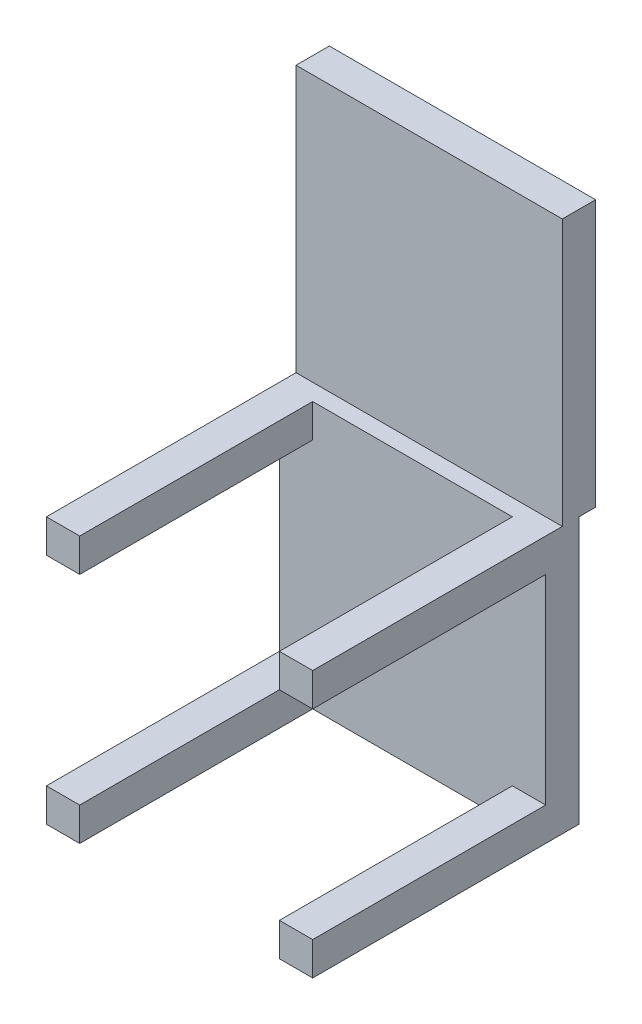
ISO-10303-21;
HEADER;
FILE_DESCRIPTION(('STEP AP214'),'2;1');
FILE_NAME('part.step','',(''),(''),'','','');
FILE_SCHEMA(('AUTOMOTIVE_DESIGN { 1 0 10303 214 1 1 1 1 }'));
ENDSEC;
DATA;
#1=APPLICATION_CONTEXT('core data for automotive mechanical design processes');
#2=APPLICATION_PROTOCOL_DEFINITION('international standard','automotive_design',2000,#1);
#3=PRODUCT_CONTEXT('',#1,'mechanical');
#4=PRODUCT('Part','Part','',(#3));
#5=PRODUCT_RELATED_PRODUCT_CATEGORY('part','',(#4));
#6=PRODUCT_DEFINITION_FORMATION('','',#4);
#7=PRODUCT_DEFINITION_CONTEXT('part definition',#1,'design');
#8=PRODUCT_DEFINITION('design','',#6,#7);
#9=PRODUCT_DEFINITION_SHAPE('','',#8);
#10=(LENGTH_UNIT() NAMED_UNIT(*) SI_UNIT(.MILLI.,.METRE.));
#11=(NAMED_UNIT(*) PLANE_ANGLE_UNIT() SI_UNIT($,.RADIAN.));
#12=(NAMED_UNIT(*) SI_UNIT($,.STERADIAN.) SOLID_ANGLE_UNIT());
#13=UNCERTAINTY_MEASURE_WITH_UNIT(LENGTH_MEASURE(1.E-05),#10,'distance_accuracy_value','');
#14=(GEOMETRIC_REPRESENTATION_CONTEXT(3) GLOBAL_UNCERTAINTY_ASSIGNED_CONTEXT((#13)) GLOBAL_UNIT_ASSIGNED_CONTEXT((#10,
#11,#12)) REPRESENTATION_CONTEXT('',''));
#15=CARTESIAN_POINT('',(0.,0.,0.));
#16=DIRECTION('',(0.,0.,1.));
#17=DIRECTION('',(1.,0.,0.));
#18=AXIS2_PLACEMENT_3D('',#15,#16,#17);
#19=CARTESIAN_POINT('',(-200.,200.,50.));
#20=DIRECTION('',(0.,-1.,0.));
#21=DIRECTION('',(0.,0.,-1.));
#22=AXIS2_PLACEMENT_3D('',#19,#20,#21);
#23=PLANE('',#22);
#24=DIRECTION('',(1.,0.,0.));
#25=VECTOR('',#24,1.);
#26=CARTESIAN_POINT('',(-200.,200.,25.));
#27=LINE('',#26,#25);
#28=CARTESIAN_POINT('',(-200.,200.,25.));
#29=VERTEX_POINT('',#28);
#30=CARTESIAN_POINT('',(200.,200.,25.));
#31=VERTEX_POINT('',#30);
#32=EDGE_CURVE('E55',#29,#31,#27,.T.);
#33=ORIENTED_EDGE('',*,*,#32,.F.);
#34=DIRECTION('',(0.,0.,-1.));
#35=VECTOR('',#34,1.);
#36=CARTESIAN_POINT('',(-200.,200.,50.));
#37=LINE('',#36,#35);
#38=CARTESIAN_POINT('',(-200.,200.,400.));
#39=VERTEX_POINT('',#38);
#40=EDGE_CURVE('E49',#39,#29,#37,.T.);
#41=ORIENTED_EDGE('',*,*,#40,.F.);
#42=DIRECTION('',(-1.,0.,0.));
#43=VECTOR('',#42,1.);
#44=CARTESIAN_POINT('',(-200.,200.,400.));
#45=LINE('',#44,#43);
#46=CARTESIAN_POINT('',(-150.,200.,400.));
#47=VERTEX_POINT('',#46);
#48=EDGE_CURVE('E256',#47,#39,#45,.T.);
#49=ORIENTED_EDGE('',*,*,#48,.F.);
#50=DIRECTION('',(0.,0.,-1.));
#51=VECTOR('',#50,1.);
#52=CARTESIAN_POINT('',(-150.,200.,400.));
#53=LINE('',#52,#51);
#54=CARTESIAN_POINT('',(-150.,200.,50.));
#55=VERTEX_POINT('',#54);
#56=EDGE_CURVE('E269',#47,#55,#53,.T.);
#57=ORIENTED_EDGE('',*,*,#56,.T.);
#58=DIRECTION('',(-1.,0.,0.));
#59=VECTOR('',#58,1.);
#60=CARTESIAN_POINT('',(-200.,200.,50.));
#61=LINE('',#60,#59);
#62=CARTESIAN_POINT('',(150.,200.,50.));
#63=VERTEX_POINT('',#62);
#64=EDGE_CURVE('E305',#63,#55,#61,.T.);
#65=ORIENTED_EDGE('',*,*,#64,.F.);
#66=DIRECTION('',(0.,0.,-1.));
#67=VECTOR('',#66,1.);
#68=CARTESIAN_POINT('',(150.,200.,400.));
#69=LINE('',#68,#67);
#70=CARTESIAN_POINT('',(150.,200.,400.));
#71=VERTEX_POINT('',#70);
#72=EDGE_CURVE('E293',#71,#63,#69,.T.);
#73=ORIENTED_EDGE('',*,*,#72,.F.);
#74=DIRECTION('',(-1.,0.,0.));
#75=VECTOR('',#74,1.);
#76=CARTESIAN_POINT('',(150.,200.,400.));
#77=LINE('',#76,#75);
#78=CARTESIAN_POINT('',(200.,200.,400.));
#79=VERTEX_POINT('',#78);
#80=EDGE_CURVE('E281',#79,#71,#77,.T.);
#81=ORIENTED_EDGE('',*,*,#80,.F.);
#82=DIRECTION('',(0.,0.,-1.));
#83=VECTOR('',#82,1.);
#84=CARTESIAN_POINT('',(200.,200.,50.));
#85=LINE('',#84,#83);
#86=EDGE_CURVE('E11',#79,#31,#85,.T.);
#87=ORIENTED_EDGE('',*,*,#86,.T.);
#88=EDGE_LOOP('',(#33,#41,#49,#57,#65,#73,#81,#87));
#89=FACE_BOUND('',#88,.T.);
#90=ADVANCED_FACE('F41',(#89),#23,.F.);
#91=CARTESIAN_POINT('',(0.,0.,50.));
#92=DIRECTION('',(0.,0.,-1.));
#93=DIRECTION('',(-1.,0.,0.));
#94=AXIS2_PLACEMENT_3D('',#91,#92,#93);
#95=PLANE('',#94);
#96=DIRECTION('',(0.,1.,0.));
#97=VECTOR('',#96,1.);
#98=CARTESIAN_POINT('',(-150.,0.,50.));
#99=LINE('',#98,#97);
#100=CARTESIAN_POINT('',(-150.,-200.,50.));
#101=VERTEX_POINT('',#100);
#102=CARTESIAN_POINT('',(-150.,-150.,50.));
#103=VERTEX_POINT('',#102);
#104=EDGE_CURVE('E226',#101,#103,#99,.T.);
#105=ORIENTED_EDGE('',*,*,#104,.F.);
#106=DIRECTION('',(1.,0.,0.));
#107=VECTOR('',#106,1.);
#108=CARTESIAN_POINT('',(-200.,-200.,50.));
#109=LINE('',#108,#107);
#110=CARTESIAN_POINT('',(150.,-200.,50.));
#111=VERTEX_POINT('',#110);
#112=EDGE_CURVE('E310',#101,#111,#109,.T.);
#113=ORIENTED_EDGE('',*,*,#112,.T.);
#114=DIRECTION('',(0.,-1.,0.));
#115=VECTOR('',#114,1.);
#116=CARTESIAN_POINT('',(150.,0.,50.));
#117=LINE('',#116,#115);
#118=CARTESIAN_POINT('',(150.,-150.,50.));
#119=VERTEX_POINT('',#118);
#120=EDGE_CURVE('E247',#119,#111,#117,.T.);
#121=ORIENTED_EDGE('',*,*,#120,.F.);
#122=DIRECTION('',(-1.,0.,0.));
#123=VECTOR('',#122,1.);
#124=CARTESIAN_POINT('',(0.,-150.,50.));
#125=LINE('',#124,#123);
#126=CARTESIAN_POINT('',(200.,-150.,50.));
#127=VERTEX_POINT('',#126);
#128=EDGE_CURVE('E250',#127,#119,#125,.T.);
#129=ORIENTED_EDGE('',*,*,#128,.F.);
#130=DIRECTION('',(0.,1.,0.));
#131=VECTOR('',#130,1.);
#132=CARTESIAN_POINT('',(200.,-200.,50.));
#133=LINE('',#132,#131);
#134=CARTESIAN_POINT('',(200.,150.,50.));
#135=VERTEX_POINT('',#134);
#136=EDGE_CURVE('E303',#127,#135,#133,.T.);
#137=ORIENTED_EDGE('',*,*,#136,.T.);
#138=DIRECTION('',(1.,0.,0.));
#139=VECTOR('',#138,1.);
#140=CARTESIAN_POINT('',(0.,150.,50.));
#141=LINE('',#140,#139);
#142=CARTESIAN_POINT('',(150.,150.,50.));
#143=VERTEX_POINT('',#142);
#144=EDGE_CURVE('E296',#143,#135,#141,.T.);
#145=ORIENTED_EDGE('',*,*,#144,.F.);
#146=DIRECTION('',(0.,-1.,0.));
#147=VECTOR('',#146,1.);
#148=CARTESIAN_POINT('',(150.,0.,50.));
#149=LINE('',#148,#147);
#150=EDGE_CURVE('E299',#63,#143,#149,.T.);
#151=ORIENTED_EDGE('',*,*,#150,.F.);
#152=ORIENTED_EDGE('',*,*,#64,.T.);
#153=DIRECTION('',(0.,1.,0.));
#154=VECTOR('',#153,1.);
#155=CARTESIAN_POINT('',(-150.,0.,50.));
#156=LINE('',#155,#154);
#157=CARTESIAN_POINT('',(-150.,150.,50.));
#158=VERTEX_POINT('',#157);
#159=EDGE_CURVE('E275',#158,#55,#156,.T.);
#160=ORIENTED_EDGE('',*,*,#159,.F.);
#161=DIRECTION('',(1.,0.,0.));
#162=VECTOR('',#161,1.);
#163=CARTESIAN_POINT('',(0.,150.,50.));
#164=LINE('',#163,#162);
#165=CARTESIAN_POINT('',(-200.,150.,50.));
#166=VERTEX_POINT('',#165);
#167=EDGE_CURVE('E272',#166,#158,#164,.T.);
#168=ORIENTED_EDGE('',*,*,#167,.F.);
#169=DIRECTION('',(0.,-1.,0.));
#170=VECTOR('',#169,1.);
#171=CARTESIAN_POINT('',(-200.,-200.,50.));
#172=LINE('',#171,#170);
#173=CARTESIAN_POINT('',(-200.,-150.,50.));
#174=VERTEX_POINT('',#173);
#175=EDGE_CURVE('E308',#166,#174,#172,.T.);
#176=ORIENTED_EDGE('',*,*,#175,.T.);
#177=DIRECTION('',(-1.,0.,0.));
#178=VECTOR('',#177,1.);
#179=CARTESIAN_POINT('',(0.,-150.,50.));
#180=LINE('',#179,#178);
#181=EDGE_CURVE('E63',#103,#174,#180,.T.);
#182=ORIENTED_EDGE('',*,*,#181,.F.);
#183=EDGE_LOOP('',(#105,#113,#121,#129,#137,#145,#151,#152,#160,#168,#176,#182));
#184=FACE_BOUND('',#183,.T.);
#185=ADVANCED_FACE('F378',(#184),#95,.F.);
#186=CARTESIAN_POINT('',(200.,-200.,50.));
#187=DIRECTION('',(-1.,0.,0.));
#188=DIRECTION('',(0.,0.,1.));
#189=AXIS2_PLACEMENT_3D('',#186,#187,#188);
#190=PLANE('',#189);
#191=DIRECTION('',(0.,1.,0.));
#192=VECTOR('',#191,1.);
#193=CARTESIAN_POINT('',(200.,-200.,0.));
#194=LINE('',#193,#192);
#195=CARTESIAN_POINT('',(200.,-200.,0.));
#196=VERTEX_POINT('',#195);
#197=CARTESIAN_POINT('',(200.,200.,0.));
#198=VERTEX_POINT('',#197);
#199=EDGE_CURVE('E302',#196,#198,#194,.T.);
#200=ORIENTED_EDGE('',*,*,#199,.T.);
#201=DIRECTION('',(0.,0.,-1.));
#202=VECTOR('',#201,1.);
#203=CARTESIAN_POINT('',(200.,200.,25.));
#204=LINE('',#203,#202);
#205=CARTESIAN_POINT('',(200.,200.,-25.));
#206=VERTEX_POINT('',#205);
#207=EDGE_CURVE('E199',#198,#206,#204,.T.);
#208=ORIENTED_EDGE('',*,*,#207,.T.);
#209=DIRECTION('',(0.,-1.,0.));
#210=VECTOR('',#209,1.);
#211=CARTESIAN_POINT('',(200.,600.,-25.));
#212=LINE('',#211,#210);
#213=CARTESIAN_POINT('',(200.,600.,-25.));
#214=VERTEX_POINT('',#213);
#215=EDGE_CURVE('E182',#214,#206,#212,.T.);
#216=ORIENTED_EDGE('',*,*,#215,.F.);
#217=DIRECTION('',(0.,0.,-1.));
#218=VECTOR('',#217,1.);
#219=CARTESIAN_POINT('',(200.,600.,25.));
#220=LINE('',#219,#218);
#221=CARTESIAN_POINT('',(200.,600.,25.));
#222=VERTEX_POINT('',#221);
#223=EDGE_CURVE('E188',#222,#214,#220,.T.);
#224=ORIENTED_EDGE('',*,*,#223,.F.);
#225=DIRECTION('',(0.,-1.,0.));
#226=VECTOR('',#225,1.);
#227=CARTESIAN_POINT('',(200.,600.,25.));
#228=LINE('',#227,#226);
#229=EDGE_CURVE('E332',#222,#31,#228,.T.);
#230=ORIENTED_EDGE('',*,*,#229,.T.);
#231=ORIENTED_EDGE('',*,*,#86,.F.);
#232=DIRECTION('',(0.,1.,0.));
#233=VECTOR('',#232,1.);
#234=CARTESIAN_POINT('',(200.,150.,400.));
#235=LINE('',#234,#233);
#236=CARTESIAN_POINT('',(200.,150.,400.));
#237=VERTEX_POINT('',#236);
#238=EDGE_CURVE('E278',#237,#79,#235,.T.);
#239=ORIENTED_EDGE('',*,*,#238,.F.);
#240=DIRECTION('',(0.,0.,-1.));
#241=VECTOR('',#240,1.);
#242=CARTESIAN_POINT('',(200.,150.,400.));
#243=LINE('',#242,#241);
#244=EDGE_CURVE('E287',#237,#135,#243,.T.);
#245=ORIENTED_EDGE('',*,*,#244,.T.);
#246=ORIENTED_EDGE('',*,*,#136,.F.);
#247=DIRECTION('',(0.,0.,-1.));
#248=VECTOR('',#247,1.);
#249=CARTESIAN_POINT('',(200.,-150.,400.));
#250=LINE('',#249,#248);
#251=CARTESIAN_POINT('',(200.,-150.,400.));
#252=VERTEX_POINT('',#251);
#253=EDGE_CURVE('E244',#252,#127,#250,.T.);
#254=ORIENTED_EDGE('',*,*,#253,.F.);
#255=DIRECTION('',(0.,1.,0.));
#256=VECTOR('',#255,1.);
#257=CARTESIAN_POINT('',(200.,-200.,400.));
#258=LINE('',#257,#256);
#259=CARTESIAN_POINT('',(200.,-200.,400.));
#260=VERTEX_POINT('',#259);
#261=EDGE_CURVE('E228',#260,#252,#258,.T.);
#262=ORIENTED_EDGE('',*,*,#261,.F.);
#263=DIRECTION('',(0.,0.,-1.));
#264=VECTOR('',#263,1.);
#265=CARTESIAN_POINT('',(200.,-200.,50.));
#266=LINE('',#265,#264);
#267=EDGE_CURVE('E312',#260,#196,#266,.T.);
#268=ORIENTED_EDGE('',*,*,#267,.T.);
#269=EDGE_LOOP('',(#200,#208,#216,#224,#230,#231,#239,#245,#246,#254,#262,#268));
#270=FACE_BOUND('',#269,.T.);
#271=ADVANCED_FACE('F43',(#270),#190,.F.);
#272=CARTESIAN_POINT('',(-200.,-200.,50.));
#273=DIRECTION('',(1.,0.,0.));
#274=DIRECTION('',(0.,0.,-1.));
#275=AXIS2_PLACEMENT_3D('',#272,#273,#274);
#276=PLANE('',#275);
#277=DIRECTION('',(0.,-1.,0.));
#278=VECTOR('',#277,1.);
#279=CARTESIAN_POINT('',(-200.,-200.,0.));
#280=LINE('',#279,#278);
#281=CARTESIAN_POINT('',(-200.,200.,0.));
#282=VERTEX_POINT('',#281);
#283=CARTESIAN_POINT('',(-200.,-200.,0.));
#284=VERTEX_POINT('',#283);
#285=EDGE_CURVE('E317',#282,#284,#280,.T.);
#286=ORIENTED_EDGE('',*,*,#285,.T.);
#287=DIRECTION('',(0.,0.,-1.));
#288=VECTOR('',#287,1.);
#289=CARTESIAN_POINT('',(-200.,-200.,50.));
#290=LINE('',#289,#288);
#291=CARTESIAN_POINT('',(-200.,-200.,400.));
#292=VERTEX_POINT('',#291);
#293=EDGE_CURVE('E323',#292,#284,#290,.T.);
#294=ORIENTED_EDGE('',*,*,#293,.F.);
#295=DIRECTION('',(0.,-1.,0.));
#296=VECTOR('',#295,1.);
#297=CARTESIAN_POINT('',(-200.,-200.,400.));
#298=LINE('',#297,#296);
#299=CARTESIAN_POINT('',(-200.,-150.,400.));
#300=VERTEX_POINT('',#299);
#301=EDGE_CURVE('E211',#300,#292,#298,.T.);
#302=ORIENTED_EDGE('',*,*,#301,.F.);
#303=DIRECTION('',(0.,0.,-1.));
#304=VECTOR('',#303,1.);
#305=CARTESIAN_POINT('',(-200.,-150.,400.));
#306=LINE('',#305,#304);
#307=EDGE_CURVE('E219',#300,#174,#306,.T.);
#308=ORIENTED_EDGE('',*,*,#307,.T.);
#309=ORIENTED_EDGE('',*,*,#175,.F.);
#310=DIRECTION('',(0.,0.,-1.));
#311=VECTOR('',#310,1.);
#312=CARTESIAN_POINT('',(-200.,150.,400.));
#313=LINE('',#312,#311);
#314=CARTESIAN_POINT('',(-200.,150.,400.));
#315=VERTEX_POINT('',#314);
#316=EDGE_CURVE('E266',#315,#166,#313,.T.);
#317=ORIENTED_EDGE('',*,*,#316,.F.);
#318=DIRECTION('',(0.,-1.,0.));
#319=VECTOR('',#318,1.);
#320=CARTESIAN_POINT('',(-200.,150.,400.));
#321=LINE('',#320,#319);
#322=EDGE_CURVE('E259',#39,#315,#321,.T.);
#323=ORIENTED_EDGE('',*,*,#322,.F.);
#324=ORIENTED_EDGE('',*,*,#40,.T.);
#325=DIRECTION('',(0.,-1.,0.));
#326=VECTOR('',#325,1.);
#327=CARTESIAN_POINT('',(-200.,600.,25.));
#328=LINE('',#327,#326);
#329=CARTESIAN_POINT('',(-200.,600.,25.));
#330=VERTEX_POINT('',#329);
#331=EDGE_CURVE('E206',#330,#29,#328,.T.);
#332=ORIENTED_EDGE('',*,*,#331,.F.);
#333=DIRECTION('',(0.,0.,1.));
#334=VECTOR('',#333,1.);
#335=CARTESIAN_POINT('',(-200.,600.,25.));
#336=LINE('',#335,#334);
#337=CARTESIAN_POINT('',(-200.,600.,-25.));
#338=VERTEX_POINT('',#337);
#339=EDGE_CURVE('E187',#338,#330,#336,.T.);
#340=ORIENTED_EDGE('',*,*,#339,.F.);
#341=DIRECTION('',(0.,-1.,0.));
#342=VECTOR('',#341,1.);
#343=CARTESIAN_POINT('',(-200.,600.,-25.));
#344=LINE('',#343,#342);
#345=CARTESIAN_POINT('',(-200.,200.,-25.));
#346=VERTEX_POINT('',#345);
#347=EDGE_CURVE('E184',#338,#346,#344,.T.);
#348=ORIENTED_EDGE('',*,*,#347,.T.);
#349=DIRECTION('',(0.,0.,1.));
#350=VECTOR('',#349,1.);
#351=CARTESIAN_POINT('',(-200.,200.,25.));
#352=LINE('',#351,#350);
#353=EDGE_CURVE('E336',#346,#282,#352,.T.);
#354=ORIENTED_EDGE('',*,*,#353,.T.);
#355=EDGE_LOOP('',(#286,#294,#302,#308,#309,#317,#323,#324,#332,#340,#348,#354));
#356=FACE_BOUND('',#355,.T.);
#357=ADVANCED_FACE('F328',(#356),#276,.F.);
#358=CARTESIAN_POINT('',(-200.,-200.,50.));
#359=DIRECTION('',(0.,1.,0.));
#360=DIRECTION('',(0.,0.,1.));
#361=AXIS2_PLACEMENT_3D('',#358,#359,#360);
#362=PLANE('',#361);
#363=DIRECTION('',(1.,0.,0.));
#364=VECTOR('',#363,1.);
#365=CARTESIAN_POINT('',(-200.,-200.,0.));
#366=LINE('',#365,#364);
#367=EDGE_CURVE('E306',#284,#196,#366,.T.);
#368=ORIENTED_EDGE('',*,*,#367,.T.);
#369=ORIENTED_EDGE('',*,*,#267,.F.);
#370=DIRECTION('',(1.,0.,0.));
#371=VECTOR('',#370,1.);
#372=CARTESIAN_POINT('',(150.,-200.,400.));
#373=LINE('',#372,#371);
#374=CARTESIAN_POINT('',(150.,-200.,400.));
#375=VERTEX_POINT('',#374);
#376=EDGE_CURVE('E235',#375,#260,#373,.T.);
#377=ORIENTED_EDGE('',*,*,#376,.F.);
#378=DIRECTION('',(0.,0.,-1.));
#379=VECTOR('',#378,1.);
#380=CARTESIAN_POINT('',(150.,-200.,400.));
#381=LINE('',#380,#379);
#382=EDGE_CURVE('E238',#375,#111,#381,.T.);
#383=ORIENTED_EDGE('',*,*,#382,.T.);
#384=ORIENTED_EDGE('',*,*,#112,.F.);
#385=DIRECTION('',(0.,0.,-1.));
#386=VECTOR('',#385,1.);
#387=CARTESIAN_POINT('',(-150.,-200.,400.));
#388=LINE('',#387,#386);
#389=CARTESIAN_POINT('',(-150.,-200.,400.));
#390=VERTEX_POINT('',#389);
#391=EDGE_CURVE('E216',#390,#101,#388,.T.);
#392=ORIENTED_EDGE('',*,*,#391,.F.);
#393=DIRECTION('',(1.,0.,0.));
#394=VECTOR('',#393,1.);
#395=CARTESIAN_POINT('',(-200.,-200.,400.));
#396=LINE('',#395,#394);
#397=EDGE_CURVE('E214',#292,#390,#396,.T.);
#398=ORIENTED_EDGE('',*,*,#397,.F.);
#399=ORIENTED_EDGE('',*,*,#293,.T.);
#400=EDGE_LOOP('',(#368,#369,#377,#383,#384,#392,#398,#399));
#401=FACE_BOUND('',#400,.T.);
#402=ADVANCED_FACE('F358',(#401),#362,.F.);
#403=CARTESIAN_POINT('',(0.,0.,0.));
#404=DIRECTION('',(0.,0.,-1.));
#405=DIRECTION('',(-1.,0.,0.));
#406=AXIS2_PLACEMENT_3D('',#403,#404,#405);
#407=PLANE('',#406);
#408=ORIENTED_EDGE('',*,*,#199,.F.);
#409=ORIENTED_EDGE('',*,*,#367,.F.);
#410=ORIENTED_EDGE('',*,*,#285,.F.);
#411=DIRECTION('',(-1.,0.,0.));
#412=VECTOR('',#411,1.);
#413=CARTESIAN_POINT('',(-200.,200.,0.));
#414=LINE('',#413,#412);
#415=EDGE_CURVE('E314',#198,#282,#414,.T.);
#416=ORIENTED_EDGE('',*,*,#415,.F.);
#417=EDGE_LOOP('',(#408,#409,#410,#416));
#418=FACE_BOUND('',#417,.T.);
#419=ADVANCED_FACE('F349',(#418),#407,.T.);
#420=CARTESIAN_POINT('',(150.,150.,400.));
#421=DIRECTION('',(1.,0.,0.));
#422=DIRECTION('',(0.,0.,-1.));
#423=AXIS2_PLACEMENT_3D('',#420,#421,#422);
#424=PLANE('',#423);
#425=ORIENTED_EDGE('',*,*,#72,.T.);
#426=ORIENTED_EDGE('',*,*,#150,.T.);
#427=DIRECTION('',(0.,0.,-1.));
#428=VECTOR('',#427,1.);
#429=CARTESIAN_POINT('',(150.,150.,400.));
#430=LINE('',#429,#428);
#431=CARTESIAN_POINT('',(150.,150.,400.));
#432=VERTEX_POINT('',#431);
#433=EDGE_CURVE('E290',#432,#143,#430,.T.);
#434=ORIENTED_EDGE('',*,*,#433,.F.);
#435=DIRECTION('',(0.,-1.,0.));
#436=VECTOR('',#435,1.);
#437=CARTESIAN_POINT('',(150.,150.,400.));
#438=LINE('',#437,#436);
#439=EDGE_CURVE('E283',#71,#432,#438,.T.);
#440=ORIENTED_EDGE('',*,*,#439,.F.);
#441=EDGE_LOOP('',(#425,#426,#434,#440));
#442=FACE_BOUND('',#441,.T.);
#443=ADVANCED_FACE('F381',(#442),#424,.F.);
#444=CARTESIAN_POINT('',(150.,150.,400.));
#445=DIRECTION('',(0.,1.,0.));
#446=DIRECTION('',(0.,0.,1.));
#447=AXIS2_PLACEMENT_3D('',#444,#445,#446);
#448=PLANE('',#447);
#449=ORIENTED_EDGE('',*,*,#433,.T.);
#450=ORIENTED_EDGE('',*,*,#144,.T.);
#451=ORIENTED_EDGE('',*,*,#244,.F.);
#452=DIRECTION('',(1.,0.,0.));
#453=VECTOR('',#452,1.);
#454=CARTESIAN_POINT('',(150.,150.,400.));
#455=LINE('',#454,#453);
#456=EDGE_CURVE('E285',#432,#237,#455,.T.);
#457=ORIENTED_EDGE('',*,*,#456,.F.);
#458=EDGE_LOOP('',(#449,#450,#451,#457));
#459=FACE_BOUND('',#458,.T.);
#460=ADVANCED_FACE('F385',(#459),#448,.F.);
#461=CARTESIAN_POINT('',(0.,0.,400.));
#462=DIRECTION('',(0.,0.,-1.));
#463=DIRECTION('',(-1.,0.,0.));
#464=AXIS2_PLACEMENT_3D('',#461,#462,#463);
#465=PLANE('',#464);
#466=ORIENTED_EDGE('',*,*,#238,.T.);
#467=ORIENTED_EDGE('',*,*,#80,.T.);
#468=ORIENTED_EDGE('',*,*,#439,.T.);
#469=ORIENTED_EDGE('',*,*,#456,.T.);
#470=EDGE_LOOP('',(#466,#467,#468,#469));
#471=FACE_BOUND('',#470,.T.);
#472=ADVANCED_FACE('F389',(#471),#465,.F.);
#473=CARTESIAN_POINT('',(-150.,150.,400.));
#474=DIRECTION('',(-1.,0.,0.));
#475=DIRECTION('',(0.,0.,1.));
#476=AXIS2_PLACEMENT_3D('',#473,#474,#475);
#477=PLANE('',#476);
#478=DIRECTION('',(0.,0.,-1.));
#479=VECTOR('',#478,1.);
#480=CARTESIAN_POINT('',(-150.,150.,400.));
#481=LINE('',#480,#479);
#482=CARTESIAN_POINT('',(-150.,150.,400.));
#483=VERTEX_POINT('',#482);
#484=EDGE_CURVE('E263',#483,#158,#481,.T.);
#485=ORIENTED_EDGE('',*,*,#484,.T.);
#486=ORIENTED_EDGE('',*,*,#159,.T.);
#487=ORIENTED_EDGE('',*,*,#56,.F.);
#488=DIRECTION('',(0.,1.,0.));
#489=VECTOR('',#488,1.);
#490=CARTESIAN_POINT('',(-150.,150.,400.));
#491=LINE('',#490,#489);
#492=EDGE_CURVE('E253',#483,#47,#491,.T.);
#493=ORIENTED_EDGE('',*,*,#492,.F.);
#494=EDGE_LOOP('',(#485,#486,#487,#493));
#495=FACE_BOUND('',#494,.T.);
#496=ADVANCED_FACE('F377',(#495),#477,.F.);
#497=CARTESIAN_POINT('',(-200.,150.,400.));
#498=DIRECTION('',(0.,1.,0.));
#499=DIRECTION('',(0.,0.,1.));
#500=AXIS2_PLACEMENT_3D('',#497,#498,#499);
#501=PLANE('',#500);
#502=ORIENTED_EDGE('',*,*,#316,.T.);
#503=ORIENTED_EDGE('',*,*,#167,.T.);
#504=ORIENTED_EDGE('',*,*,#484,.F.);
#505=DIRECTION('',(1.,0.,0.));
#506=VECTOR('',#505,1.);
#507=CARTESIAN_POINT('',(-200.,150.,400.));
#508=LINE('',#507,#506);
#509=EDGE_CURVE('E261',#315,#483,#508,.T.);
#510=ORIENTED_EDGE('',*,*,#509,.F.);
#511=EDGE_LOOP('',(#502,#503,#504,#510));
#512=FACE_BOUND('',#511,.T.);
#513=ADVANCED_FACE('F368',(#512),#501,.F.);
#514=CARTESIAN_POINT('',(0.,0.,400.));
#515=DIRECTION('',(0.,0.,-1.));
#516=DIRECTION('',(-1.,0.,0.));
#517=AXIS2_PLACEMENT_3D('',#514,#515,#516);
#518=PLANE('',#517);
#519=ORIENTED_EDGE('',*,*,#492,.T.);
#520=ORIENTED_EDGE('',*,*,#48,.T.);
#521=ORIENTED_EDGE('',*,*,#322,.T.);
#522=ORIENTED_EDGE('',*,*,#509,.T.);
#523=EDGE_LOOP('',(#519,#520,#521,#522));
#524=FACE_BOUND('',#523,.T.);
#525=ADVANCED_FACE('F372',(#524),#518,.F.);
#526=CARTESIAN_POINT('',(150.,-150.,400.));
#527=DIRECTION('',(0.,-1.,0.));
#528=DIRECTION('',(0.,0.,-1.));
#529=AXIS2_PLACEMENT_3D('',#526,#527,#528);
#530=PLANE('',#529);
#531=ORIENTED_EDGE('',*,*,#253,.T.);
#532=ORIENTED_EDGE('',*,*,#128,.T.);
#533=DIRECTION('',(0.,0.,-1.));
#534=VECTOR('',#533,1.);
#535=CARTESIAN_POINT('',(150.,-150.,400.));
#536=LINE('',#535,#534);
#537=CARTESIAN_POINT('',(150.,-150.,400.));
#538=VERTEX_POINT('',#537);
#539=EDGE_CURVE('E241',#538,#119,#536,.T.);
#540=ORIENTED_EDGE('',*,*,#539,.F.);
#541=DIRECTION('',(-1.,0.,0.));
#542=VECTOR('',#541,1.);
#543=CARTESIAN_POINT('',(150.,-150.,400.));
#544=LINE('',#543,#542);
#545=EDGE_CURVE('E231',#252,#538,#544,.T.);
#546=ORIENTED_EDGE('',*,*,#545,.F.);
#547=EDGE_LOOP('',(#531,#532,#540,#546));
#548=FACE_BOUND('',#547,.T.);
#549=ADVANCED_FACE('F395',(#548),#530,.F.);
#550=CARTESIAN_POINT('',(150.,-200.,400.));
#551=DIRECTION('',(1.,0.,0.));
#552=DIRECTION('',(0.,0.,-1.));
#553=AXIS2_PLACEMENT_3D('',#550,#551,#552);
#554=PLANE('',#553);
#555=ORIENTED_EDGE('',*,*,#539,.T.);
#556=ORIENTED_EDGE('',*,*,#120,.T.);
#557=ORIENTED_EDGE('',*,*,#382,.F.);
#558=DIRECTION('',(0.,-1.,0.));
#559=VECTOR('',#558,1.);
#560=CARTESIAN_POINT('',(150.,-200.,400.));
#561=LINE('',#560,#559);
#562=EDGE_CURVE('E233',#538,#375,#561,.T.);
#563=ORIENTED_EDGE('',*,*,#562,.F.);
#564=EDGE_LOOP('',(#555,#556,#557,#563));
#565=FACE_BOUND('',#564,.T.);
#566=ADVANCED_FACE('F403',(#565),#554,.F.);
#567=CARTESIAN_POINT('',(0.,0.,400.));
#568=DIRECTION('',(0.,0.,-1.));
#569=DIRECTION('',(-1.,0.,0.));
#570=AXIS2_PLACEMENT_3D('',#567,#568,#569);
#571=PLANE('',#570);
#572=ORIENTED_EDGE('',*,*,#261,.T.);
#573=ORIENTED_EDGE('',*,*,#545,.T.);
#574=ORIENTED_EDGE('',*,*,#562,.T.);
#575=ORIENTED_EDGE('',*,*,#376,.T.);
#576=EDGE_LOOP('',(#572,#573,#574,#575));
#577=FACE_BOUND('',#576,.T.);
#578=ADVANCED_FACE('F399',(#577),#571,.F.);
#579=CARTESIAN_POINT('',(-150.,-200.,400.));
#580=DIRECTION('',(-1.,0.,0.));
#581=DIRECTION('',(0.,0.,1.));
#582=AXIS2_PLACEMENT_3D('',#579,#580,#581);
#583=PLANE('',#582);
#584=ORIENTED_EDGE('',*,*,#391,.T.);
#585=ORIENTED_EDGE('',*,*,#104,.T.);
#586=DIRECTION('',(0.,0.,-1.));
#587=VECTOR('',#586,1.);
#588=CARTESIAN_POINT('',(-150.,-150.,400.));
#589=LINE('',#588,#587);
#590=CARTESIAN_POINT('',(-150.,-150.,400.));
#591=VERTEX_POINT('',#590);
#592=EDGE_CURVE('E222',#591,#103,#589,.T.);
#593=ORIENTED_EDGE('',*,*,#592,.F.);
#594=DIRECTION('',(0.,1.,0.));
#595=VECTOR('',#594,1.);
#596=CARTESIAN_POINT('',(-150.,-200.,400.));
#597=LINE('',#596,#595);
#598=EDGE_CURVE('E201',#390,#591,#597,.T.);
#599=ORIENTED_EDGE('',*,*,#598,.F.);
#600=EDGE_LOOP('',(#584,#585,#593,#599));
#601=FACE_BOUND('',#600,.T.);
#602=ADVANCED_FACE('F362',(#601),#583,.F.);
#603=CARTESIAN_POINT('',(-200.,-150.,400.));
#604=DIRECTION('',(0.,-1.,0.));
#605=DIRECTION('',(0.,0.,-1.));
#606=AXIS2_PLACEMENT_3D('',#603,#604,#605);
#607=PLANE('',#606);
#608=ORIENTED_EDGE('',*,*,#592,.T.);
#609=ORIENTED_EDGE('',*,*,#181,.T.);
#610=ORIENTED_EDGE('',*,*,#307,.F.);
#611=DIRECTION('',(-1.,0.,0.));
#612=VECTOR('',#611,1.);
#613=CARTESIAN_POINT('',(-200.,-150.,400.));
#614=LINE('',#613,#612);
#615=EDGE_CURVE('E204',#591,#300,#614,.T.);
#616=ORIENTED_EDGE('',*,*,#615,.F.);
#617=EDGE_LOOP('',(#608,#609,#610,#616));
#618=FACE_BOUND('',#617,.T.);
#619=ADVANCED_FACE('F364',(#618),#607,.F.);
#620=CARTESIAN_POINT('',(0.,0.,400.));
#621=DIRECTION('',(0.,0.,-1.));
#622=DIRECTION('',(-1.,0.,0.));
#623=AXIS2_PLACEMENT_3D('',#620,#621,#622);
#624=PLANE('',#623);
#625=ORIENTED_EDGE('',*,*,#598,.T.);
#626=ORIENTED_EDGE('',*,*,#615,.T.);
#627=ORIENTED_EDGE('',*,*,#301,.T.);
#628=ORIENTED_EDGE('',*,*,#397,.T.);
#629=EDGE_LOOP('',(#625,#626,#627,#628));
#630=FACE_BOUND('',#629,.T.);
#631=ADVANCED_FACE('F355',(#630),#624,.F.);
#632=CARTESIAN_POINT('',(-200.,600.,-25.));
#633=DIRECTION('',(0.,0.,1.));
#634=DIRECTION('',(1.,0.,0.));
#635=AXIS2_PLACEMENT_3D('',#632,#633,#634);
#636=PLANE('',#635);
#637=DIRECTION('',(-1.,0.,0.));
#638=VECTOR('',#637,1.);
#639=CARTESIAN_POINT('',(-200.,200.,-25.));
#640=LINE('',#639,#638);
#641=EDGE_CURVE('E339',#206,#346,#640,.T.);
#642=ORIENTED_EDGE('',*,*,#641,.T.);
#643=ORIENTED_EDGE('',*,*,#347,.F.);
#644=DIRECTION('',(-1.,0.,0.));
#645=VECTOR('',#644,1.);
#646=CARTESIAN_POINT('',(-200.,600.,-25.));
#647=LINE('',#646,#645);
#648=EDGE_CURVE('E178',#214,#338,#647,.T.);
#649=ORIENTED_EDGE('',*,*,#648,.F.);
#650=ORIENTED_EDGE('',*,*,#215,.T.);
#651=EDGE_LOOP('',(#642,#643,#649,#650));
#652=FACE_BOUND('',#651,.T.);
#653=ADVANCED_FACE('F180',(#652),#636,.F.);
#654=CARTESIAN_POINT('',(-200.,600.,25.));
#655=DIRECTION('',(0.,0.,-1.));
#656=DIRECTION('',(-1.,0.,0.));
#657=AXIS2_PLACEMENT_3D('',#654,#655,#656);
#658=PLANE('',#657);
#659=ORIENTED_EDGE('',*,*,#32,.T.);
#660=ORIENTED_EDGE('',*,*,#229,.F.);
#661=DIRECTION('',(1.,0.,0.));
#662=VECTOR('',#661,1.);
#663=CARTESIAN_POINT('',(-200.,600.,25.));
#664=LINE('',#663,#662);
#665=EDGE_CURVE('E193',#330,#222,#664,.T.);
#666=ORIENTED_EDGE('',*,*,#665,.F.);
#667=ORIENTED_EDGE('',*,*,#331,.T.);
#668=EDGE_LOOP('',(#659,#660,#666,#667));
#669=FACE_BOUND('',#668,.T.);
#670=ADVANCED_FACE('F331',(#669),#658,.F.);
#671=CARTESIAN_POINT('',(0.,600.,0.));
#672=DIRECTION('',(0.,-1.,0.));
#673=DIRECTION('',(0.,0.,-1.));
#674=AXIS2_PLACEMENT_3D('',#671,#672,#673);
#675=PLANE('',#674);
#676=ORIENTED_EDGE('',*,*,#223,.T.);
#677=ORIENTED_EDGE('',*,*,#648,.T.);
#678=ORIENTED_EDGE('',*,*,#339,.T.);
#679=ORIENTED_EDGE('',*,*,#665,.T.);
#680=EDGE_LOOP('',(#676,#677,#678,#679));
#681=FACE_BOUND('',#680,.T.);
#682=ADVANCED_FACE('F191',(#681),#675,.F.);
#683=CARTESIAN_POINT('',(0.,200.,0.));
#684=DIRECTION('',(0.,-1.,0.));
#685=DIRECTION('',(0.,0.,-1.));
#686=AXIS2_PLACEMENT_3D('',#683,#684,#685);
#687=PLANE('',#686);
#688=ORIENTED_EDGE('',*,*,#207,.F.);
#689=ORIENTED_EDGE('',*,*,#415,.T.);
#690=ORIENTED_EDGE('',*,*,#353,.F.);
#691=ORIENTED_EDGE('',*,*,#641,.F.);
#692=EDGE_LOOP('',(#688,#689,#690,#691));
#693=FACE_BOUND('',#692,.T.);
#694=ADVANCED_FACE('F345',(#693),#687,.T.);
#695=CLOSED_SHELL('',(#90,#185,#271,#357,#402,#419,#443,#460,#472,#496,#513,#525,#549,#566,#578,
#602,#619,#631,#653,#670,#682,#694));
#696=MANIFOLD_SOLID_BREP('B2',#695);
#697=ADVANCED_BREP_SHAPE_REPRESENTATION('',(#18,#696),#14);
#698=SHAPE_DEFINITION_REPRESENTATION(#9,#697);
ENDSEC;
END-ISO-10303-21;
